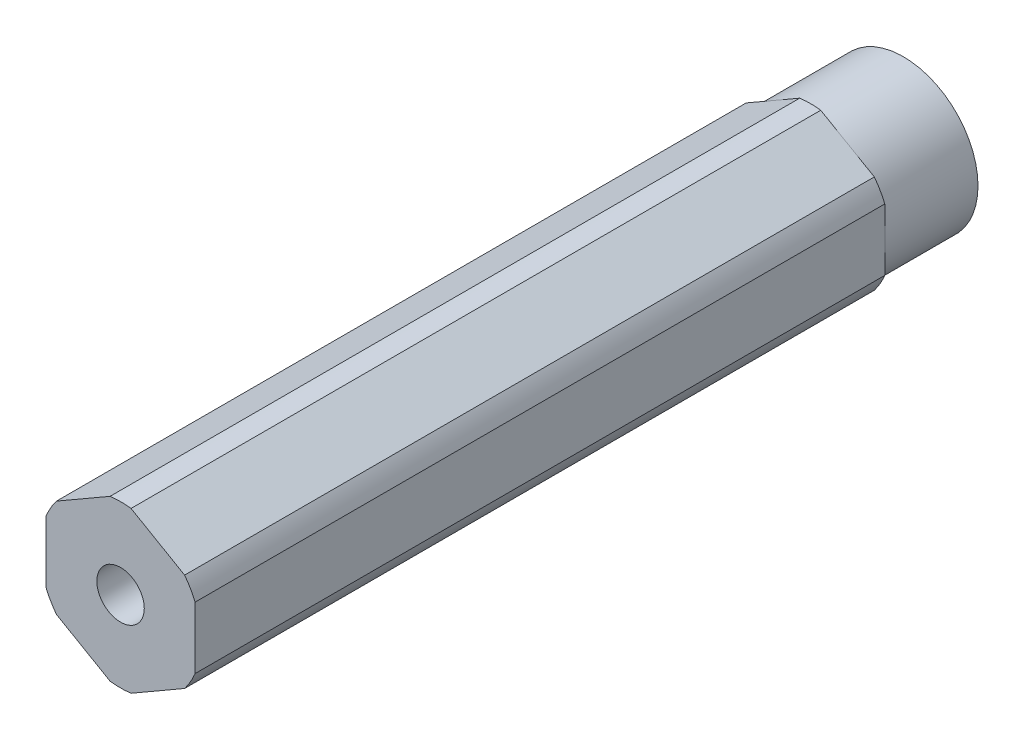
ISO-10303-21;
HEADER;
FILE_DESCRIPTION(('STEP AP214'),'2;1');
FILE_NAME('part.step','',(''),(''),'','','');
FILE_SCHEMA(('AUTOMOTIVE_DESIGN { 1 0 10303 214 1 1 1 1 }'));
ENDSEC;
DATA;
#1=APPLICATION_CONTEXT('core data for automotive mechanical design processes');
#2=APPLICATION_PROTOCOL_DEFINITION('international standard','automotive_design',2000,#1);
#3=PRODUCT_CONTEXT('',#1,'mechanical');
#4=PRODUCT('Part','Part','',(#3));
#5=PRODUCT_RELATED_PRODUCT_CATEGORY('part','',(#4));
#6=PRODUCT_DEFINITION_FORMATION('','',#4);
#7=PRODUCT_DEFINITION_CONTEXT('part definition',#1,'design');
#8=PRODUCT_DEFINITION('design','',#6,#7);
#9=PRODUCT_DEFINITION_SHAPE('','',#8);
#10=(LENGTH_UNIT() NAMED_UNIT(*) SI_UNIT(.MILLI.,.METRE.));
#11=(NAMED_UNIT(*) PLANE_ANGLE_UNIT() SI_UNIT($,.RADIAN.));
#12=(NAMED_UNIT(*) SI_UNIT($,.STERADIAN.) SOLID_ANGLE_UNIT());
#13=UNCERTAINTY_MEASURE_WITH_UNIT(LENGTH_MEASURE(1.E-05),#10,'distance_accuracy_value','');
#14=(GEOMETRIC_REPRESENTATION_CONTEXT(3) GLOBAL_UNCERTAINTY_ASSIGNED_CONTEXT((#13)) GLOBAL_UNIT_ASSIGNED_CONTEXT((#10,
#11,#12)) REPRESENTATION_CONTEXT('',''));
#15=CARTESIAN_POINT('',(0.,0.,0.));
#16=DIRECTION('',(0.,0.,1.));
#17=DIRECTION('',(1.,0.,0.));
#18=AXIS2_PLACEMENT_3D('',#15,#16,#17);
#19=CARTESIAN_POINT('',(0.,0.,33.3375));
#20=DIRECTION('',(0.,0.,-1.));
#21=DIRECTION('',(-1.,0.,0.));
#22=AXIS2_PLACEMENT_3D('',#19,#20,#21);
#23=CYLINDRICAL_SURFACE('',#22,6.875);
#24=CARTESIAN_POINT('',(0.,0.,-25.4));
#25=DIRECTION('',(0.,0.,-1.));
#26=DIRECTION('',(-1.,0.,0.));
#27=AXIS2_PLACEMENT_3D('',#24,#25,#26);
#28=CIRCLE('',#27,6.875);
#29=CARTESIAN_POINT('',(-0.893039494206792,6.81675182633099,-25.4));
#30=VERTEX_POINT('',#29);
#31=CARTESIAN_POINT('',(0.893039494206792,6.81675182633099,-25.4));
#32=VERTEX_POINT('',#31);
#33=EDGE_CURVE('E322',#30,#32,#28,.T.);
#34=ORIENTED_EDGE('',*,*,#33,.F.);
#35=DIRECTION('',(0.,0.,-1.));
#36=VECTOR('',#35,1.);
#37=CARTESIAN_POINT('',(-0.893039494206789,6.81675182633099,33.3375));
#38=LINE('',#37,#36);
#39=CARTESIAN_POINT('',(-0.893039494206789,6.81675182633099,33.3375));
#40=VERTEX_POINT('',#39);
#41=EDGE_CURVE('E296',#40,#30,#38,.T.);
#42=ORIENTED_EDGE('',*,*,#41,.F.);
#43=CARTESIAN_POINT('',(0.,0.,33.3375));
#44=DIRECTION('',(0.,0.,1.));
#45=DIRECTION('',(1.,0.,0.));
#46=AXIS2_PLACEMENT_3D('',#43,#44,#45);
#47=CIRCLE('',#46,6.875);
#48=CARTESIAN_POINT('',(0.893039494206792,6.81675182633099,33.3375));
#49=VERTEX_POINT('',#48);
#50=EDGE_CURVE('E216',#49,#40,#47,.T.);
#51=ORIENTED_EDGE('',*,*,#50,.F.);
#52=DIRECTION('',(0.,0.,-1.));
#53=VECTOR('',#52,1.);
#54=CARTESIAN_POINT('',(0.893039494206792,6.81675182633099,33.3375));
#55=LINE('',#54,#53);
#56=EDGE_CURVE('E255',#49,#32,#55,.T.);
#57=ORIENTED_EDGE('',*,*,#56,.T.);
#58=EDGE_LOOP('',(#34,#42,#51,#57));
#59=FACE_BOUND('',#58,.T.);
#60=ADVANCED_FACE('F56',(#59),#23,.T.);
#61=CARTESIAN_POINT('',(-0.893039494206789,6.81675182633099,33.3375));
#62=DIRECTION('',(0.5,-0.866025403784439,0.));
#63=DIRECTION('',(0.866025403784439,0.5,0.));
#64=AXIS2_PLACEMENT_3D('',#61,#62,#63);
#65=PLANE('',#64);
#66=DIRECTION('',(0.866025403784439,0.5,0.));
#67=VECTOR('',#66,1.);
#68=CARTESIAN_POINT('',(-0.893039494206789,6.81675182633099,-25.4));
#69=LINE('',#68,#67);
#70=CARTESIAN_POINT('',(-5.45696050579321,4.18177080173138,-25.4));
#71=VERTEX_POINT('',#70);
#72=CARTESIAN_POINT('',(-3.175,5.49926131403119,-25.4));
#73=VERTEX_POINT('',#72);
#74=EDGE_CURVE('E195',#71,#73,#69,.T.);
#75=ORIENTED_EDGE('',*,*,#74,.F.);
#76=DIRECTION('',(0.,0.,-1.));
#77=VECTOR('',#76,1.);
#78=CARTESIAN_POINT('',(-5.45696050579321,4.18177080173138,33.3375));
#79=LINE('',#78,#77);
#80=CARTESIAN_POINT('',(-5.45696050579321,4.18177080173138,33.3375));
#81=VERTEX_POINT('',#80);
#82=EDGE_CURVE('E292',#81,#71,#79,.T.);
#83=ORIENTED_EDGE('',*,*,#82,.F.);
#84=DIRECTION('',(-0.866025403784439,-0.5,0.));
#85=VECTOR('',#84,1.);
#86=CARTESIAN_POINT('',(-0.893039494206789,6.81675182633099,33.3375));
#87=LINE('',#86,#85);
#88=EDGE_CURVE('E223',#40,#81,#87,.T.);
#89=ORIENTED_EDGE('',*,*,#88,.F.);
#90=ORIENTED_EDGE('',*,*,#41,.T.);
#91=EDGE_CURVE('E178',#73,#30,#69,.T.);
#92=ORIENTED_EDGE('',*,*,#91,.F.);
#93=EDGE_LOOP('',(#75,#83,#89,#90,#92));
#94=FACE_BOUND('',#93,.T.);
#95=ADVANCED_FACE('F334',(#94),#65,.F.);
#96=CARTESIAN_POINT('',(0.,0.,33.3375));
#97=DIRECTION('',(0.,0.,-1.));
#98=DIRECTION('',(-1.,0.,0.));
#99=AXIS2_PLACEMENT_3D('',#96,#97,#98);
#100=CYLINDRICAL_SURFACE('',#99,6.875);
#101=CARTESIAN_POINT('',(-6.35,2.63498102459961,-25.4));
#102=VERTEX_POINT('',#101);
#103=EDGE_CURVE('E337',#102,#71,#28,.T.);
#104=ORIENTED_EDGE('',*,*,#103,.F.);
#105=DIRECTION('',(0.,0.,-1.));
#106=VECTOR('',#105,1.);
#107=CARTESIAN_POINT('',(-6.35,2.63498102459961,33.3375));
#108=LINE('',#107,#106);
#109=CARTESIAN_POINT('',(-6.35,2.63498102459961,33.3375));
#110=VERTEX_POINT('',#109);
#111=EDGE_CURVE('E201',#110,#102,#108,.T.);
#112=ORIENTED_EDGE('',*,*,#111,.F.);
#113=CARTESIAN_POINT('',(0.,0.,33.3375));
#114=DIRECTION('',(0.,0.,1.));
#115=DIRECTION('',(1.,0.,0.));
#116=AXIS2_PLACEMENT_3D('',#113,#114,#115);
#117=CIRCLE('',#116,6.875);
#118=EDGE_CURVE('E226',#81,#110,#117,.T.);
#119=ORIENTED_EDGE('',*,*,#118,.F.);
#120=ORIENTED_EDGE('',*,*,#82,.T.);
#121=EDGE_LOOP('',(#104,#112,#119,#120));
#122=FACE_BOUND('',#121,.T.);
#123=ADVANCED_FACE('F336',(#122),#100,.T.);
#124=CARTESIAN_POINT('',(-6.35,2.63498102459961,33.3375));
#125=DIRECTION('',(1.,0.,0.));
#126=DIRECTION('',(0.,0.,-1.));
#127=AXIS2_PLACEMENT_3D('',#124,#125,#126);
#128=PLANE('',#127);
#129=DIRECTION('',(0.,1.,0.));
#130=VECTOR('',#129,1.);
#131=CARTESIAN_POINT('',(-6.35,2.63498102459961,-25.4));
#132=LINE('',#131,#130);
#133=CARTESIAN_POINT('',(-6.35,-2.63498102459961,-25.4));
#134=VERTEX_POINT('',#133);
#135=CARTESIAN_POINT('',(-6.35,0.,-25.4));
#136=VERTEX_POINT('',#135);
#137=EDGE_CURVE('E166',#134,#136,#132,.T.);
#138=ORIENTED_EDGE('',*,*,#137,.F.);
#139=DIRECTION('',(0.,0.,-1.));
#140=VECTOR('',#139,1.);
#141=CARTESIAN_POINT('',(-6.35,-2.63498102459961,33.3375));
#142=LINE('',#141,#140);
#143=CARTESIAN_POINT('',(-6.35,-2.63498102459961,33.3375));
#144=VERTEX_POINT('',#143);
#145=EDGE_CURVE('E287',#144,#134,#142,.T.);
#146=ORIENTED_EDGE('',*,*,#145,.F.);
#147=DIRECTION('',(0.,-1.,0.));
#148=VECTOR('',#147,1.);
#149=CARTESIAN_POINT('',(-6.35,2.63498102459961,33.3375));
#150=LINE('',#149,#148);
#151=EDGE_CURVE('E229',#110,#144,#150,.T.);
#152=ORIENTED_EDGE('',*,*,#151,.F.);
#153=ORIENTED_EDGE('',*,*,#111,.T.);
#154=EDGE_CURVE('E179',#136,#102,#132,.T.);
#155=ORIENTED_EDGE('',*,*,#154,.F.);
#156=EDGE_LOOP('',(#138,#146,#152,#153,#155));
#157=FACE_BOUND('',#156,.T.);
#158=ADVANCED_FACE('F198',(#157),#128,.F.);
#159=CARTESIAN_POINT('',(0.,0.,33.3375));
#160=DIRECTION('',(0.,0.,-1.));
#161=DIRECTION('',(-1.,0.,0.));
#162=AXIS2_PLACEMENT_3D('',#159,#160,#161);
#163=CYLINDRICAL_SURFACE('',#162,6.875);
#164=CARTESIAN_POINT('',(-5.45696050579321,-4.18177080173138,-25.4));
#165=VERTEX_POINT('',#164);
#166=EDGE_CURVE('E172',#165,#134,#28,.T.);
#167=ORIENTED_EDGE('',*,*,#166,.F.);
#168=DIRECTION('',(0.,0.,-1.));
#169=VECTOR('',#168,1.);
#170=CARTESIAN_POINT('',(-5.45696050579321,-4.18177080173138,33.3375));
#171=LINE('',#170,#169);
#172=CARTESIAN_POINT('',(-5.45696050579321,-4.18177080173138,33.3375));
#173=VERTEX_POINT('',#172);
#174=EDGE_CURVE('E283',#173,#165,#171,.T.);
#175=ORIENTED_EDGE('',*,*,#174,.F.);
#176=CARTESIAN_POINT('',(0.,0.,33.3375));
#177=DIRECTION('',(0.,0.,1.));
#178=DIRECTION('',(1.,0.,0.));
#179=AXIS2_PLACEMENT_3D('',#176,#177,#178);
#180=CIRCLE('',#179,6.875);
#181=EDGE_CURVE('E232',#144,#173,#180,.T.);
#182=ORIENTED_EDGE('',*,*,#181,.F.);
#183=ORIENTED_EDGE('',*,*,#145,.T.);
#184=EDGE_LOOP('',(#167,#175,#182,#183));
#185=FACE_BOUND('',#184,.T.);
#186=ADVANCED_FACE('F343',(#185),#163,.T.);
#187=CARTESIAN_POINT('',(-5.45696050579321,-4.18177080173138,33.3375));
#188=DIRECTION('',(0.5,0.866025403784439,0.));
#189=DIRECTION('',(-0.866025403784439,0.5,0.));
#190=AXIS2_PLACEMENT_3D('',#187,#188,#189);
#191=PLANE('',#190);
#192=DIRECTION('',(-0.866025403784439,0.5,0.));
#193=VECTOR('',#192,1.);
#194=CARTESIAN_POINT('',(-5.45696050579321,-4.18177080173138,-25.4));
#195=LINE('',#194,#193);
#196=CARTESIAN_POINT('',(-0.893039494206789,-6.81675182633099,-25.4));
#197=VERTEX_POINT('',#196);
#198=CARTESIAN_POINT('',(-3.175,-5.49926131403119,-25.4));
#199=VERTEX_POINT('',#198);
#200=EDGE_CURVE('E203',#197,#199,#195,.T.);
#201=ORIENTED_EDGE('',*,*,#200,.F.);
#202=DIRECTION('',(0.,0.,-1.));
#203=VECTOR('',#202,1.);
#204=CARTESIAN_POINT('',(-0.893039494206789,-6.81675182633099,33.3375));
#205=LINE('',#204,#203);
#206=CARTESIAN_POINT('',(-0.893039494206789,-6.81675182633099,33.3375));
#207=VERTEX_POINT('',#206);
#208=EDGE_CURVE('E279',#207,#197,#205,.T.);
#209=ORIENTED_EDGE('',*,*,#208,.F.);
#210=DIRECTION('',(0.866025403784439,-0.5,0.));
#211=VECTOR('',#210,1.);
#212=CARTESIAN_POINT('',(-5.45696050579321,-4.18177080173138,33.3375));
#213=LINE('',#212,#211);
#214=EDGE_CURVE('E235',#173,#207,#213,.T.);
#215=ORIENTED_EDGE('',*,*,#214,.F.);
#216=ORIENTED_EDGE('',*,*,#174,.T.);
#217=EDGE_CURVE('E206',#199,#165,#195,.T.);
#218=ORIENTED_EDGE('',*,*,#217,.F.);
#219=EDGE_LOOP('',(#201,#209,#215,#216,#218));
#220=FACE_BOUND('',#219,.T.);
#221=ADVANCED_FACE('F346',(#220),#191,.F.);
#222=CARTESIAN_POINT('',(0.,0.,33.3375));
#223=DIRECTION('',(0.,0.,-1.));
#224=DIRECTION('',(-1.,0.,0.));
#225=AXIS2_PLACEMENT_3D('',#222,#223,#224);
#226=CYLINDRICAL_SURFACE('',#225,6.875);
#227=CARTESIAN_POINT('',(0.893039494206791,-6.81675182633099,-25.4));
#228=VERTEX_POINT('',#227);
#229=EDGE_CURVE('E381',#228,#197,#28,.T.);
#230=ORIENTED_EDGE('',*,*,#229,.F.);
#231=DIRECTION('',(0.,0.,-1.));
#232=VECTOR('',#231,1.);
#233=CARTESIAN_POINT('',(0.893039494206785,-6.81675182633099,33.3375));
#234=LINE('',#233,#232);
#235=CARTESIAN_POINT('',(0.893039494206785,-6.81675182633099,33.3375));
#236=VERTEX_POINT('',#235);
#237=EDGE_CURVE('E275',#236,#228,#234,.T.);
#238=ORIENTED_EDGE('',*,*,#237,.F.);
#239=CARTESIAN_POINT('',(0.,0.,33.3375));
#240=DIRECTION('',(0.,0.,1.));
#241=DIRECTION('',(1.,0.,0.));
#242=AXIS2_PLACEMENT_3D('',#239,#240,#241);
#243=CIRCLE('',#242,6.875);
#244=EDGE_CURVE('E238',#207,#236,#243,.T.);
#245=ORIENTED_EDGE('',*,*,#244,.F.);
#246=ORIENTED_EDGE('',*,*,#208,.T.);
#247=EDGE_LOOP('',(#230,#238,#245,#246));
#248=FACE_BOUND('',#247,.T.);
#249=ADVANCED_FACE('F351',(#248),#226,.T.);
#250=CARTESIAN_POINT('',(0.893039494206788,-6.81675182633099,33.3375));
#251=DIRECTION('',(-0.5,0.866025403784439,0.));
#252=DIRECTION('',(-0.866025403784439,-0.5,0.));
#253=AXIS2_PLACEMENT_3D('',#250,#251,#252);
#254=PLANE('',#253);
#255=DIRECTION('',(-0.866025403784439,-0.5,0.));
#256=VECTOR('',#255,1.);
#257=CARTESIAN_POINT('',(0.893039494206788,-6.81675182633099,-25.4));
#258=LINE('',#257,#256);
#259=CARTESIAN_POINT('',(5.45696050579321,-4.18177080173138,-25.4));
#260=VERTEX_POINT('',#259);
#261=CARTESIAN_POINT('',(3.175,-5.49926131403119,-25.4));
#262=VERTEX_POINT('',#261);
#263=EDGE_CURVE('E360',#260,#262,#258,.T.);
#264=ORIENTED_EDGE('',*,*,#263,.F.);
#265=DIRECTION('',(0.,0.,-1.));
#266=VECTOR('',#265,1.);
#267=CARTESIAN_POINT('',(5.45696050579321,-4.18177080173138,33.3375));
#268=LINE('',#267,#266);
#269=CARTESIAN_POINT('',(5.45696050579321,-4.18177080173138,33.3375));
#270=VERTEX_POINT('',#269);
#271=EDGE_CURVE('E271',#270,#260,#268,.T.);
#272=ORIENTED_EDGE('',*,*,#271,.F.);
#273=DIRECTION('',(0.866025403784439,0.5,0.));
#274=VECTOR('',#273,1.);
#275=CARTESIAN_POINT('',(0.893039494206788,-6.81675182633099,33.3375));
#276=LINE('',#275,#274);
#277=EDGE_CURVE('E241',#236,#270,#276,.T.);
#278=ORIENTED_EDGE('',*,*,#277,.F.);
#279=ORIENTED_EDGE('',*,*,#237,.T.);
#280=EDGE_CURVE('E372',#262,#228,#258,.T.);
#281=ORIENTED_EDGE('',*,*,#280,.F.);
#282=EDGE_LOOP('',(#264,#272,#278,#279,#281));
#283=FACE_BOUND('',#282,.T.);
#284=ADVANCED_FACE('F358',(#283),#254,.F.);
#285=CARTESIAN_POINT('',(0.,0.,33.3375));
#286=DIRECTION('',(0.,0.,-1.));
#287=DIRECTION('',(-1.,0.,0.));
#288=AXIS2_PLACEMENT_3D('',#285,#286,#287);
#289=CYLINDRICAL_SURFACE('',#288,6.875);
#290=CARTESIAN_POINT('',(6.34999999999999,-2.63498102459962,-25.4));
#291=VERTEX_POINT('',#290);
#292=EDGE_CURVE('E323',#291,#260,#28,.T.);
#293=ORIENTED_EDGE('',*,*,#292,.F.);
#294=DIRECTION('',(0.,0.,-1.));
#295=VECTOR('',#294,1.);
#296=CARTESIAN_POINT('',(6.34999999999999,-2.63498102459962,33.3375));
#297=LINE('',#296,#295);
#298=CARTESIAN_POINT('',(6.34999999999999,-2.63498102459962,33.3375));
#299=VERTEX_POINT('',#298);
#300=EDGE_CURVE('E267',#299,#291,#297,.T.);
#301=ORIENTED_EDGE('',*,*,#300,.F.);
#302=CARTESIAN_POINT('',(0.,0.,33.3375));
#303=DIRECTION('',(0.,0.,1.));
#304=DIRECTION('',(1.,0.,0.));
#305=AXIS2_PLACEMENT_3D('',#302,#303,#304);
#306=CIRCLE('',#305,6.875);
#307=EDGE_CURVE('E244',#270,#299,#306,.T.);
#308=ORIENTED_EDGE('',*,*,#307,.F.);
#309=ORIENTED_EDGE('',*,*,#271,.T.);
#310=EDGE_LOOP('',(#293,#301,#308,#309));
#311=FACE_BOUND('',#310,.T.);
#312=ADVANCED_FACE('F363',(#311),#289,.T.);
#313=CARTESIAN_POINT('',(6.34999999999999,-2.63498102459962,33.3375));
#314=DIRECTION('',(-1.,0.,0.));
#315=DIRECTION('',(0.,0.,1.));
#316=AXIS2_PLACEMENT_3D('',#313,#314,#315);
#317=PLANE('',#316);
#318=DIRECTION('',(0.,-1.,0.));
#319=VECTOR('',#318,1.);
#320=CARTESIAN_POINT('',(6.34999999999999,-2.63498102459962,-25.4));
#321=LINE('',#320,#319);
#322=CARTESIAN_POINT('',(6.34999999999999,2.63498102459962,-25.4));
#323=VERTEX_POINT('',#322);
#324=CARTESIAN_POINT('',(6.35,0.,-25.4));
#325=VERTEX_POINT('',#324);
#326=EDGE_CURVE('E368',#323,#325,#321,.T.);
#327=ORIENTED_EDGE('',*,*,#326,.F.);
#328=DIRECTION('',(0.,0.,-1.));
#329=VECTOR('',#328,1.);
#330=CARTESIAN_POINT('',(6.34999999999999,2.63498102459962,33.3375));
#331=LINE('',#330,#329);
#332=CARTESIAN_POINT('',(6.34999999999999,2.63498102459962,33.3375));
#333=VERTEX_POINT('',#332);
#334=EDGE_CURVE('E263',#333,#323,#331,.T.);
#335=ORIENTED_EDGE('',*,*,#334,.F.);
#336=DIRECTION('',(0.,1.,0.));
#337=VECTOR('',#336,1.);
#338=CARTESIAN_POINT('',(6.34999999999999,-2.63498102459962,33.3375));
#339=LINE('',#338,#337);
#340=EDGE_CURVE('E247',#299,#333,#339,.T.);
#341=ORIENTED_EDGE('',*,*,#340,.F.);
#342=ORIENTED_EDGE('',*,*,#300,.T.);
#343=EDGE_CURVE('E369',#325,#291,#321,.T.);
#344=ORIENTED_EDGE('',*,*,#343,.F.);
#345=EDGE_LOOP('',(#327,#335,#341,#342,#344));
#346=FACE_BOUND('',#345,.T.);
#347=ADVANCED_FACE('F367',(#346),#317,.F.);
#348=CARTESIAN_POINT('',(0.,0.,33.3375));
#349=DIRECTION('',(0.,0.,-1.));
#350=DIRECTION('',(-1.,0.,0.));
#351=AXIS2_PLACEMENT_3D('',#348,#349,#350);
#352=CYLINDRICAL_SURFACE('',#351,6.875);
#353=CARTESIAN_POINT('',(5.4569605057932,4.18177080173139,-25.4));
#354=VERTEX_POINT('',#353);
#355=EDGE_CURVE('E311',#354,#323,#28,.T.);
#356=ORIENTED_EDGE('',*,*,#355,.F.);
#357=DIRECTION('',(0.,0.,-1.));
#358=VECTOR('',#357,1.);
#359=CARTESIAN_POINT('',(5.45696050579321,4.18177080173139,33.3375));
#360=LINE('',#359,#358);
#361=CARTESIAN_POINT('',(5.45696050579321,4.18177080173139,33.3375));
#362=VERTEX_POINT('',#361);
#363=EDGE_CURVE('E259',#362,#354,#360,.T.);
#364=ORIENTED_EDGE('',*,*,#363,.F.);
#365=CARTESIAN_POINT('',(0.,0.,33.3375));
#366=DIRECTION('',(0.,0.,1.));
#367=DIRECTION('',(1.,0.,0.));
#368=AXIS2_PLACEMENT_3D('',#365,#366,#367);
#369=CIRCLE('',#368,6.875);
#370=EDGE_CURVE('E250',#333,#362,#369,.T.);
#371=ORIENTED_EDGE('',*,*,#370,.F.);
#372=ORIENTED_EDGE('',*,*,#334,.T.);
#373=EDGE_LOOP('',(#356,#364,#371,#372));
#374=FACE_BOUND('',#373,.T.);
#375=ADVANCED_FACE('F318',(#374),#352,.T.);
#376=CARTESIAN_POINT('',(5.45696050579321,4.18177080173138,33.3375));
#377=DIRECTION('',(-0.5,-0.866025403784439,0.));
#378=DIRECTION('',(0.866025403784439,-0.5,0.));
#379=AXIS2_PLACEMENT_3D('',#376,#377,#378);
#380=PLANE('',#379);
#381=DIRECTION('',(0.866025403784439,-0.5,0.));
#382=VECTOR('',#381,1.);
#383=CARTESIAN_POINT('',(5.45696050579321,4.18177080173138,-25.4));
#384=LINE('',#383,#382);
#385=CARTESIAN_POINT('',(3.175,5.49926131403119,-25.4));
#386=VERTEX_POINT('',#385);
#387=EDGE_CURVE('E13',#32,#386,#384,.T.);
#388=ORIENTED_EDGE('',*,*,#387,.F.);
#389=ORIENTED_EDGE('',*,*,#56,.F.);
#390=DIRECTION('',(-0.866025403784439,0.5,0.));
#391=VECTOR('',#390,1.);
#392=CARTESIAN_POINT('',(5.45696050579321,4.18177080173138,33.3375));
#393=LINE('',#392,#391);
#394=EDGE_CURVE('E79',#362,#49,#393,.T.);
#395=ORIENTED_EDGE('',*,*,#394,.F.);
#396=ORIENTED_EDGE('',*,*,#363,.T.);
#397=EDGE_CURVE('E59',#386,#354,#384,.T.);
#398=ORIENTED_EDGE('',*,*,#397,.F.);
#399=EDGE_LOOP('',(#388,#389,#395,#396,#398));
#400=FACE_BOUND('',#399,.T.);
#401=ADVANCED_FACE('F325',(#400),#380,.F.);
#402=CARTESIAN_POINT('',(0.,0.,-33.3375));
#403=DIRECTION('',(0.,0.,1.));
#404=DIRECTION('',(1.,0.,0.));
#405=AXIS2_PLACEMENT_3D('',#402,#403,#404);
#406=PLANE('',#405);
#407=CARTESIAN_POINT('',(0.,0.,-33.3375));
#408=DIRECTION('',(0.,0.,1.));
#409=DIRECTION('',(1.,0.,0.));
#410=AXIS2_PLACEMENT_3D('',#407,#408,#409);
#411=CIRCLE('',#410,2.0193);
#412=CARTESIAN_POINT('',(2.0193,0.,-33.3375));
#413=VERTEX_POINT('',#412);
#414=EDGE_CURVE('E212',#413,#413,#411,.T.);
#415=ORIENTED_EDGE('',*,*,#414,.T.);
#416=EDGE_LOOP('',(#415));
#417=FACE_BOUND('',#416,.T.);
#418=CARTESIAN_POINT('',(0.,0.,-33.3375));
#419=DIRECTION('',(0.,0.,1.));
#420=DIRECTION('',(1.,0.,0.));
#421=AXIS2_PLACEMENT_3D('',#418,#419,#420);
#422=CIRCLE('',#421,6.35);
#423=CARTESIAN_POINT('',(6.35,0.,-33.3375));
#424=VERTEX_POINT('',#423);
#425=EDGE_CURVE('E299',#424,#424,#422,.T.);
#426=ORIENTED_EDGE('',*,*,#425,.F.);
#427=EDGE_LOOP('',(#426));
#428=FACE_BOUND('',#427,.T.);
#429=ADVANCED_FACE('F438',(#417,#428),#406,.F.);
#430=CARTESIAN_POINT('',(0.,0.,33.3375));
#431=DIRECTION('',(0.,0.,1.));
#432=DIRECTION('',(1.,0.,0.));
#433=AXIS2_PLACEMENT_3D('',#430,#431,#432);
#434=PLANE('',#433);
#435=CARTESIAN_POINT('',(0.,0.,33.3375));
#436=DIRECTION('',(0.,0.,1.));
#437=DIRECTION('',(1.,0.,0.));
#438=AXIS2_PLACEMENT_3D('',#435,#436,#437);
#439=CIRCLE('',#438,2.0193);
#440=CARTESIAN_POINT('',(2.0193,0.,33.3375));
#441=VERTEX_POINT('',#440);
#442=EDGE_CURVE('E217',#441,#441,#439,.T.);
#443=ORIENTED_EDGE('',*,*,#442,.F.);
#444=EDGE_LOOP('',(#443));
#445=FACE_BOUND('',#444,.T.);
#446=ORIENTED_EDGE('',*,*,#50,.T.);
#447=ORIENTED_EDGE('',*,*,#88,.T.);
#448=ORIENTED_EDGE('',*,*,#118,.T.);
#449=ORIENTED_EDGE('',*,*,#151,.T.);
#450=ORIENTED_EDGE('',*,*,#181,.T.);
#451=ORIENTED_EDGE('',*,*,#214,.T.);
#452=ORIENTED_EDGE('',*,*,#244,.T.);
#453=ORIENTED_EDGE('',*,*,#277,.T.);
#454=ORIENTED_EDGE('',*,*,#307,.T.);
#455=ORIENTED_EDGE('',*,*,#340,.T.);
#456=ORIENTED_EDGE('',*,*,#370,.T.);
#457=ORIENTED_EDGE('',*,*,#394,.T.);
#458=EDGE_LOOP('',(#446,#447,#448,#449,#450,#451,#452,#453,#454,#455,#456,#457));
#459=FACE_BOUND('',#458,.T.);
#460=ADVANCED_FACE('F330',(#445,#459),#434,.T.);
#461=CARTESIAN_POINT('',(0.,0.,-33.3375));
#462=DIRECTION('',(0.,0.,1.));
#463=DIRECTION('',(1.,0.,0.));
#464=AXIS2_PLACEMENT_3D('',#461,#462,#463);
#465=CYLINDRICAL_SURFACE('',#464,2.0193);
#466=ORIENTED_EDGE('',*,*,#442,.T.);
#467=EDGE_LOOP('',(#466));
#468=FACE_BOUND('',#467,.T.);
#469=ORIENTED_EDGE('',*,*,#414,.F.);
#470=EDGE_LOOP('',(#469));
#471=FACE_BOUND('',#470,.T.);
#472=ADVANCED_FACE('F443',(#468,#471),#465,.F.);
#473=CARTESIAN_POINT('',(0.,0.,-25.4));
#474=DIRECTION('',(0.,0.,-1.));
#475=DIRECTION('',(-1.,0.,0.));
#476=AXIS2_PLACEMENT_3D('',#473,#474,#475);
#477=PLANE('',#476);
#478=ORIENTED_EDGE('',*,*,#74,.T.);
#479=CARTESIAN_POINT('',(0.,0.,-25.4));
#480=DIRECTION('',(0.,0.,-1.));
#481=DIRECTION('',(-1.,0.,0.));
#482=AXIS2_PLACEMENT_3D('',#479,#480,#481);
#483=CIRCLE('',#482,6.35);
#484=EDGE_CURVE('E183',#136,#73,#483,.T.);
#485=ORIENTED_EDGE('',*,*,#484,.F.);
#486=ORIENTED_EDGE('',*,*,#154,.T.);
#487=ORIENTED_EDGE('',*,*,#103,.T.);
#488=EDGE_LOOP('',(#478,#485,#486,#487));
#489=FACE_BOUND('',#488,.T.);
#490=ADVANCED_FACE('F192',(#489),#477,.T.);
#491=ORIENTED_EDGE('',*,*,#91,.T.);
#492=ORIENTED_EDGE('',*,*,#33,.T.);
#493=ORIENTED_EDGE('',*,*,#387,.T.);
#494=EDGE_CURVE('E71',#73,#386,#483,.T.);
#495=ORIENTED_EDGE('',*,*,#494,.F.);
#496=EDGE_LOOP('',(#491,#492,#493,#495));
#497=FACE_BOUND('',#496,.T.);
#498=ADVANCED_FACE('F408',(#497),#477,.T.);
#499=ORIENTED_EDGE('',*,*,#137,.T.);
#500=EDGE_CURVE('E169',#199,#136,#483,.T.);
#501=ORIENTED_EDGE('',*,*,#500,.F.);
#502=ORIENTED_EDGE('',*,*,#217,.T.);
#503=ORIENTED_EDGE('',*,*,#166,.T.);
#504=EDGE_LOOP('',(#499,#501,#502,#503));
#505=FACE_BOUND('',#504,.T.);
#506=ADVANCED_FACE('F168',(#505),#477,.T.);
#507=ORIENTED_EDGE('',*,*,#200,.T.);
#508=EDGE_CURVE('E187',#262,#199,#483,.T.);
#509=ORIENTED_EDGE('',*,*,#508,.F.);
#510=ORIENTED_EDGE('',*,*,#280,.T.);
#511=ORIENTED_EDGE('',*,*,#229,.T.);
#512=EDGE_LOOP('',(#507,#509,#510,#511));
#513=FACE_BOUND('',#512,.T.);
#514=ADVANCED_FACE('F401',(#513),#477,.T.);
#515=ORIENTED_EDGE('',*,*,#263,.T.);
#516=EDGE_CURVE('E390',#325,#262,#483,.T.);
#517=ORIENTED_EDGE('',*,*,#516,.F.);
#518=ORIENTED_EDGE('',*,*,#343,.T.);
#519=ORIENTED_EDGE('',*,*,#292,.T.);
#520=EDGE_LOOP('',(#515,#517,#518,#519));
#521=FACE_BOUND('',#520,.T.);
#522=ADVANCED_FACE('F389',(#521),#477,.T.);
#523=ORIENTED_EDGE('',*,*,#326,.T.);
#524=EDGE_CURVE('E313',#386,#325,#483,.T.);
#525=ORIENTED_EDGE('',*,*,#524,.F.);
#526=ORIENTED_EDGE('',*,*,#397,.T.);
#527=ORIENTED_EDGE('',*,*,#355,.T.);
#528=EDGE_LOOP('',(#523,#525,#526,#527));
#529=FACE_BOUND('',#528,.T.);
#530=ADVANCED_FACE('F310',(#529),#477,.T.);
#531=CARTESIAN_POINT('',(0.,0.,-25.4));
#532=DIRECTION('',(0.,0.,-1.));
#533=DIRECTION('',(-1.,0.,0.));
#534=AXIS2_PLACEMENT_3D('',#531,#532,#533);
#535=CYLINDRICAL_SURFACE('',#534,6.35);
#536=ORIENTED_EDGE('',*,*,#425,.T.);
#537=EDGE_LOOP('',(#536));
#538=FACE_BOUND('',#537,.T.);
#539=ORIENTED_EDGE('',*,*,#484,.T.);
#540=ORIENTED_EDGE('',*,*,#494,.T.);
#541=ORIENTED_EDGE('',*,*,#524,.T.);
#542=ORIENTED_EDGE('',*,*,#516,.T.);
#543=ORIENTED_EDGE('',*,*,#508,.T.);
#544=ORIENTED_EDGE('',*,*,#500,.T.);
#545=EDGE_LOOP('',(#539,#540,#541,#542,#543,#544));
#546=FACE_BOUND('',#545,.T.);
#547=ADVANCED_FACE('F182',(#538,#546),#535,.T.);
#548=CLOSED_SHELL('',(#60,#95,#123,#158,#186,#221,#249,#284,#312,#347,#375,#401,#429,#460,#472,
#490,#498,#506,#514,#522,#530,#547));
#549=MANIFOLD_SOLID_BREP('B2',#548);
#550=ADVANCED_BREP_SHAPE_REPRESENTATION('',(#18,#549),#14);
#551=SHAPE_DEFINITION_REPRESENTATION(#9,#550);
ENDSEC;
END-ISO-10303-21;
